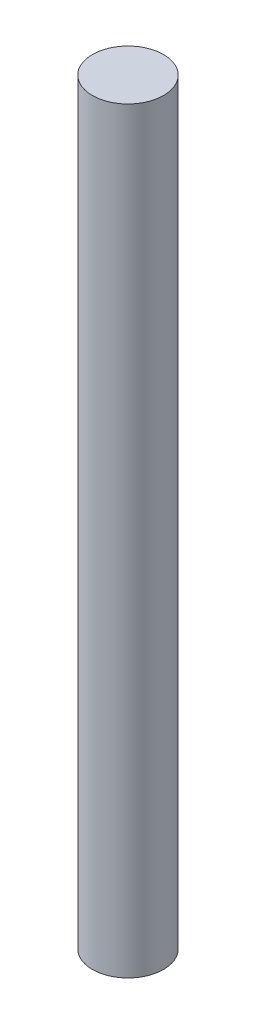
ISO-10303-21;
HEADER;
FILE_DESCRIPTION(('STEP AP214'),'2;1');
FILE_NAME('part.step','',(''),(''),'','','');
FILE_SCHEMA(('AUTOMOTIVE_DESIGN { 1 0 10303 214 1 1 1 1 }'));
ENDSEC;
DATA;
#1=APPLICATION_CONTEXT('core data for automotive mechanical design processes');
#2=APPLICATION_PROTOCOL_DEFINITION('international standard','automotive_design',2000,#1);
#3=PRODUCT_CONTEXT('',#1,'mechanical');
#4=PRODUCT('Part','Part','',(#3));
#5=PRODUCT_RELATED_PRODUCT_CATEGORY('part','',(#4));
#6=PRODUCT_DEFINITION_FORMATION('','',#4);
#7=PRODUCT_DEFINITION_CONTEXT('part definition',#1,'design');
#8=PRODUCT_DEFINITION('design','',#6,#7);
#9=PRODUCT_DEFINITION_SHAPE('','',#8);
#10=(LENGTH_UNIT() NAMED_UNIT(*) SI_UNIT(.MILLI.,.METRE.));
#11=(NAMED_UNIT(*) PLANE_ANGLE_UNIT() SI_UNIT($,.RADIAN.));
#12=(NAMED_UNIT(*) SI_UNIT($,.STERADIAN.) SOLID_ANGLE_UNIT());
#13=UNCERTAINTY_MEASURE_WITH_UNIT(LENGTH_MEASURE(1.E-05),#10,'distance_accuracy_value','');
#14=(GEOMETRIC_REPRESENTATION_CONTEXT(3) GLOBAL_UNCERTAINTY_ASSIGNED_CONTEXT((#13)) GLOBAL_UNIT_ASSIGNED_CONTEXT((#10,
#11,#12)) REPRESENTATION_CONTEXT('',''));
#15=CARTESIAN_POINT('',(0.,0.,0.));
#16=DIRECTION('',(0.,0.,1.));
#17=DIRECTION('',(1.,0.,0.));
#18=AXIS2_PLACEMENT_3D('',#15,#16,#17);
#19=CARTESIAN_POINT('',(0.,213.,0.));
#20=DIRECTION('',(0.,-1.,0.));
#21=DIRECTION('',(0.,0.,-1.));
#22=AXIS2_PLACEMENT_3D('',#19,#20,#21);
#23=CYLINDRICAL_SURFACE('',#22,10.);
#24=CARTESIAN_POINT('',(0.,213.,0.));
#25=DIRECTION('',(0.,1.,0.));
#26=DIRECTION('',(0.,0.,1.));
#27=AXIS2_PLACEMENT_3D('',#24,#25,#26);
#28=CIRCLE('',#27,10.);
#29=CARTESIAN_POINT('',(0.,213.,10.));
#30=VERTEX_POINT('',#29);
#31=EDGE_CURVE('E10',#30,#30,#28,.T.);
#32=ORIENTED_EDGE('',*,*,#31,.F.);
#33=EDGE_LOOP('',(#32));
#34=FACE_BOUND('',#33,.T.);
#35=CARTESIAN_POINT('',(0.,0.,0.));
#36=DIRECTION('',(0.,1.,0.));
#37=DIRECTION('',(0.,0.,1.));
#38=AXIS2_PLACEMENT_3D('',#35,#36,#37);
#39=CIRCLE('',#38,10.);
#40=CARTESIAN_POINT('',(0.,0.,10.));
#41=VERTEX_POINT('',#40);
#42=EDGE_CURVE('E31',#41,#41,#39,.T.);
#43=ORIENTED_EDGE('',*,*,#42,.T.);
#44=EDGE_LOOP('',(#43));
#45=FACE_BOUND('',#44,.T.);
#46=ADVANCED_FACE('F28',(#34,#45),#23,.T.);
#47=CARTESIAN_POINT('',(0.,213.,0.));
#48=DIRECTION('',(0.,1.,0.));
#49=DIRECTION('',(0.,0.,1.));
#50=AXIS2_PLACEMENT_3D('',#47,#48,#49);
#51=PLANE('',#50);
#52=ORIENTED_EDGE('',*,*,#31,.T.);
#53=EDGE_LOOP('',(#52));
#54=FACE_BOUND('',#53,.T.);
#55=ADVANCED_FACE('F43',(#54),#51,.T.);
#56=CARTESIAN_POINT('',(0.,0.,0.));
#57=DIRECTION('',(0.,1.,0.));
#58=DIRECTION('',(0.,0.,1.));
#59=AXIS2_PLACEMENT_3D('',#56,#57,#58);
#60=PLANE('',#59);
#61=ORIENTED_EDGE('',*,*,#42,.F.);
#62=EDGE_LOOP('',(#61));
#63=FACE_BOUND('',#62,.T.);
#64=ADVANCED_FACE('F41',(#63),#60,.F.);
#65=CLOSED_SHELL('',(#46,#55,#64));
#66=MANIFOLD_SOLID_BREP('B2',#65);
#67=ADVANCED_BREP_SHAPE_REPRESENTATION('',(#18,#66),#14);
#68=SHAPE_DEFINITION_REPRESENTATION(#9,#67);
ENDSEC;
END-ISO-10303-21;
